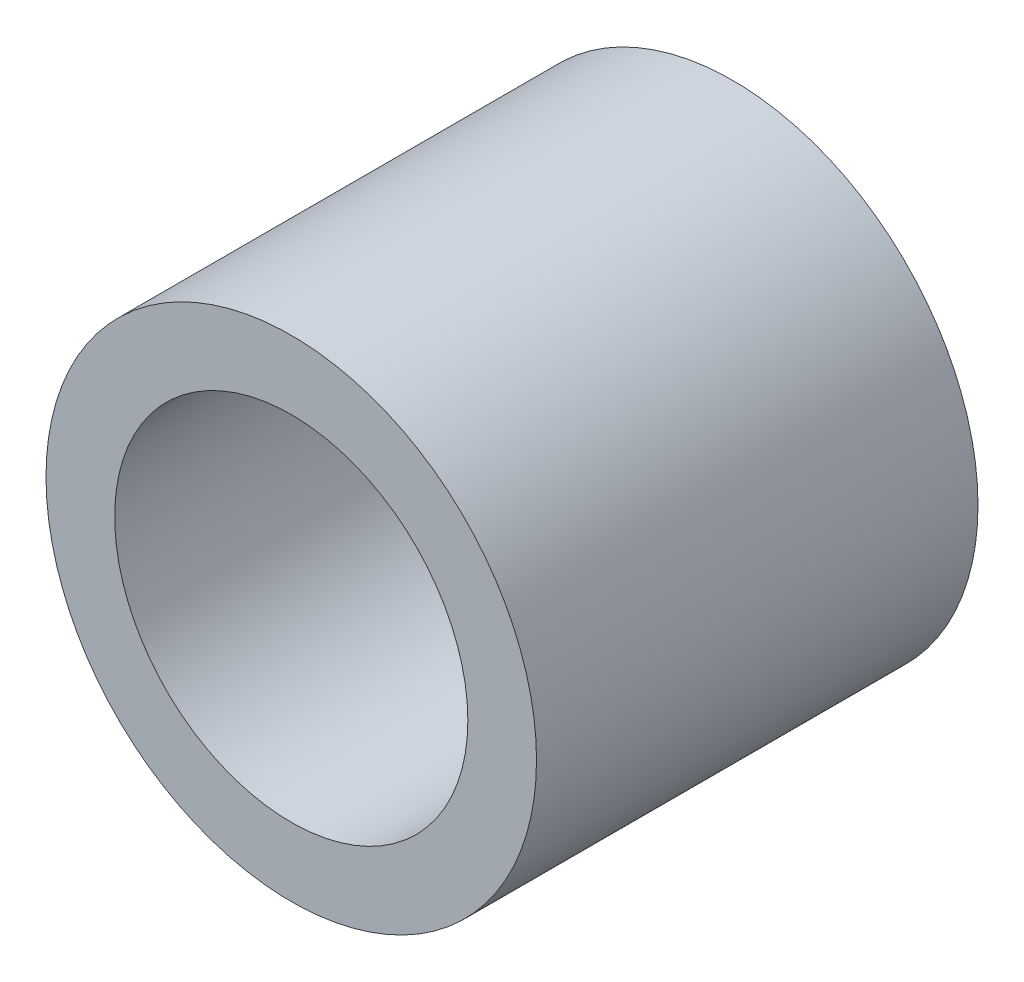
ISO-10303-21;
HEADER;
FILE_DESCRIPTION(('STEP AP214'),'2;1');
FILE_NAME('part.step','',(''),(''),'','','');
FILE_SCHEMA(('AUTOMOTIVE_DESIGN { 1 0 10303 214 1 1 1 1 }'));
ENDSEC;
DATA;
#1=APPLICATION_CONTEXT('core data for automotive mechanical design processes');
#2=APPLICATION_PROTOCOL_DEFINITION('international standard','automotive_design',2000,#1);
#3=PRODUCT_CONTEXT('',#1,'mechanical');
#4=PRODUCT('Part','Part','',(#3));
#5=PRODUCT_RELATED_PRODUCT_CATEGORY('part','',(#4));
#6=PRODUCT_DEFINITION_FORMATION('','',#4);
#7=PRODUCT_DEFINITION_CONTEXT('part definition',#1,'design');
#8=PRODUCT_DEFINITION('design','',#6,#7);
#9=PRODUCT_DEFINITION_SHAPE('','',#8);
#10=(LENGTH_UNIT() NAMED_UNIT(*) SI_UNIT(.MILLI.,.METRE.));
#11=(NAMED_UNIT(*) PLANE_ANGLE_UNIT() SI_UNIT($,.RADIAN.));
#12=(NAMED_UNIT(*) SI_UNIT($,.STERADIAN.) SOLID_ANGLE_UNIT());
#13=UNCERTAINTY_MEASURE_WITH_UNIT(LENGTH_MEASURE(1.E-05),#10,'distance_accuracy_value','');
#14=(GEOMETRIC_REPRESENTATION_CONTEXT(3) GLOBAL_UNCERTAINTY_ASSIGNED_CONTEXT((#13)) GLOBAL_UNIT_ASSIGNED_CONTEXT((#10,
#11,#12)) REPRESENTATION_CONTEXT('',''));
#15=CARTESIAN_POINT('',(0.,0.,0.));
#16=DIRECTION('',(0.,0.,1.));
#17=DIRECTION('',(1.,0.,0.));
#18=AXIS2_PLACEMENT_3D('',#15,#16,#17);
#19=CARTESIAN_POINT('',(0.,0.,11.43));
#20=DIRECTION('',(0.,0.,-1.));
#21=DIRECTION('',(-1.,0.,0.));
#22=AXIS2_PLACEMENT_3D('',#19,#20,#21);
#23=CYLINDRICAL_SURFACE('',#22,6.35);
#24=CARTESIAN_POINT('',(0.,0.,11.43));
#25=DIRECTION('',(0.,0.,1.));
#26=DIRECTION('',(1.,0.,0.));
#27=AXIS2_PLACEMENT_3D('',#24,#25,#26);
#28=CIRCLE('',#27,6.35);
#29=CARTESIAN_POINT('',(6.35,0.,11.43));
#30=VERTEX_POINT('',#29);
#31=EDGE_CURVE('E10',#30,#30,#28,.T.);
#32=ORIENTED_EDGE('',*,*,#31,.F.);
#33=EDGE_LOOP('',(#32));
#34=FACE_BOUND('',#33,.T.);
#35=CARTESIAN_POINT('',(0.,0.,0.));
#36=DIRECTION('',(0.,0.,1.));
#37=DIRECTION('',(1.,0.,0.));
#38=AXIS2_PLACEMENT_3D('',#35,#36,#37);
#39=CIRCLE('',#38,6.35);
#40=CARTESIAN_POINT('',(6.35,0.,0.));
#41=VERTEX_POINT('',#40);
#42=EDGE_CURVE('E34',#41,#41,#39,.T.);
#43=ORIENTED_EDGE('',*,*,#42,.T.);
#44=EDGE_LOOP('',(#43));
#45=FACE_BOUND('',#44,.T.);
#46=ADVANCED_FACE('F31',(#34,#45),#23,.T.);
#47=CARTESIAN_POINT('',(0.,0.,11.43));
#48=DIRECTION('',(0.,0.,1.));
#49=DIRECTION('',(1.,0.,0.));
#50=AXIS2_PLACEMENT_3D('',#47,#48,#49);
#51=PLANE('',#50);
#52=CARTESIAN_POINT('',(0.,0.,11.43));
#53=DIRECTION('',(0.,0.,1.));
#54=DIRECTION('',(1.,0.,0.));
#55=AXIS2_PLACEMENT_3D('',#52,#53,#54);
#56=CIRCLE('',#55,4.572);
#57=CARTESIAN_POINT('',(4.572,0.,11.43));
#58=VERTEX_POINT('',#57);
#59=EDGE_CURVE('E43',#58,#58,#56,.T.);
#60=ORIENTED_EDGE('',*,*,#59,.F.);
#61=EDGE_LOOP('',(#60));
#62=FACE_BOUND('',#61,.T.);
#63=ORIENTED_EDGE('',*,*,#31,.T.);
#64=EDGE_LOOP('',(#63));
#65=FACE_BOUND('',#64,.T.);
#66=ADVANCED_FACE('F58',(#62,#65),#51,.T.);
#67=CARTESIAN_POINT('',(0.,0.,0.));
#68=DIRECTION('',(0.,0.,1.));
#69=DIRECTION('',(1.,0.,0.));
#70=AXIS2_PLACEMENT_3D('',#67,#68,#69);
#71=PLANE('',#70);
#72=CARTESIAN_POINT('',(0.,0.,0.));
#73=DIRECTION('',(0.,0.,1.));
#74=DIRECTION('',(1.,0.,0.));
#75=AXIS2_PLACEMENT_3D('',#72,#73,#74);
#76=CIRCLE('',#75,4.572);
#77=CARTESIAN_POINT('',(4.572,0.,0.));
#78=VERTEX_POINT('',#77);
#79=EDGE_CURVE('E41',#78,#78,#76,.T.);
#80=ORIENTED_EDGE('',*,*,#79,.T.);
#81=EDGE_LOOP('',(#80));
#82=FACE_BOUND('',#81,.T.);
#83=ORIENTED_EDGE('',*,*,#42,.F.);
#84=EDGE_LOOP('',(#83));
#85=FACE_BOUND('',#84,.T.);
#86=ADVANCED_FACE('F49',(#82,#85),#71,.F.);
#87=CARTESIAN_POINT('',(0.,0.,0.));
#88=DIRECTION('',(0.,0.,1.));
#89=DIRECTION('',(1.,0.,0.));
#90=AXIS2_PLACEMENT_3D('',#87,#88,#89);
#91=CYLINDRICAL_SURFACE('',#90,4.572);
#92=ORIENTED_EDGE('',*,*,#79,.F.);
#93=EDGE_LOOP('',(#92));
#94=FACE_BOUND('',#93,.T.);
#95=ORIENTED_EDGE('',*,*,#59,.T.);
#96=EDGE_LOOP('',(#95));
#97=FACE_BOUND('',#96,.T.);
#98=ADVANCED_FACE('F52',(#94,#97),#91,.F.);
#99=CLOSED_SHELL('',(#46,#66,#86,#98));
#100=MANIFOLD_SOLID_BREP('B2',#99);
#101=ADVANCED_BREP_SHAPE_REPRESENTATION('',(#18,#100),#14);
#102=SHAPE_DEFINITION_REPRESENTATION(#9,#101);
ENDSEC;
END-ISO-10303-21;
